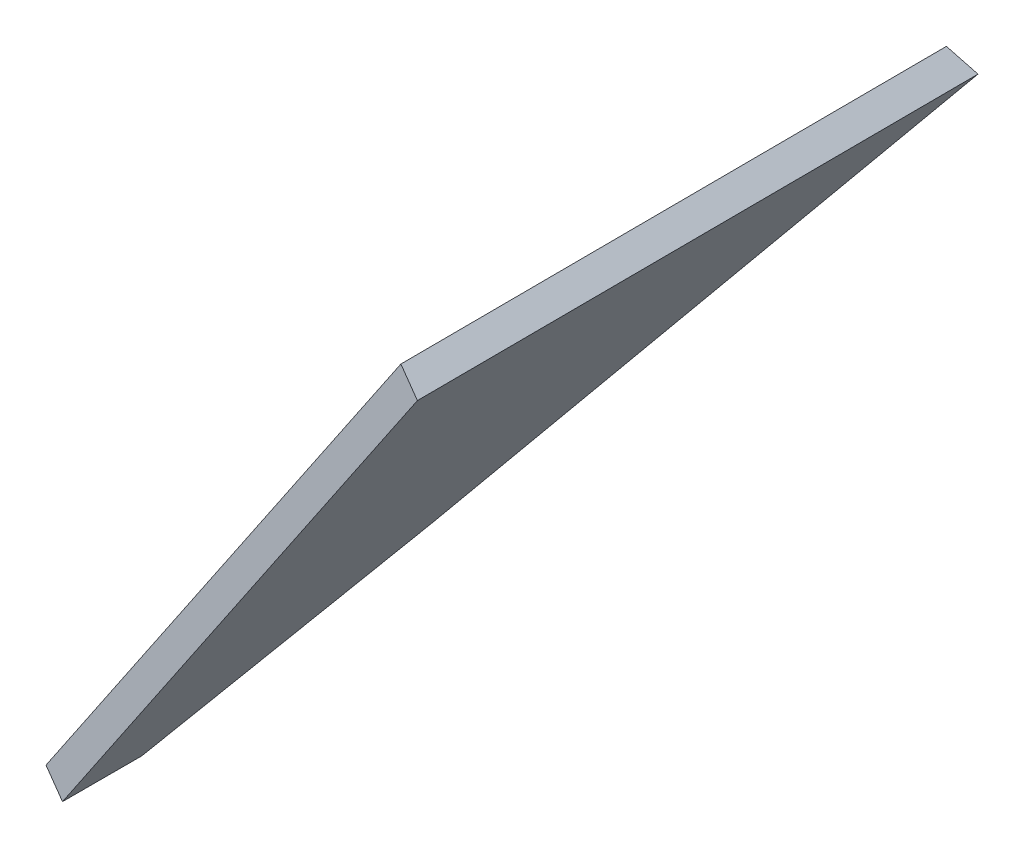
ISO-10303-21;
HEADER;
FILE_DESCRIPTION(('STEP AP214'),'2;1');
FILE_NAME('part.step','',(''),(''),'','','');
FILE_SCHEMA(('AUTOMOTIVE_DESIGN { 1 0 10303 214 1 1 1 1 }'));
ENDSEC;
DATA;
#1=APPLICATION_CONTEXT('core data for automotive mechanical design processes');
#2=APPLICATION_PROTOCOL_DEFINITION('international standard','automotive_design',2000,#1);
#3=PRODUCT_CONTEXT('',#1,'mechanical');
#4=PRODUCT('Part','Part','',(#3));
#5=PRODUCT_RELATED_PRODUCT_CATEGORY('part','',(#4));
#6=PRODUCT_DEFINITION_FORMATION('','',#4);
#7=PRODUCT_DEFINITION_CONTEXT('part definition',#1,'design');
#8=PRODUCT_DEFINITION('design','',#6,#7);
#9=PRODUCT_DEFINITION_SHAPE('','',#8);
#10=(LENGTH_UNIT() NAMED_UNIT(*) SI_UNIT(.MILLI.,.METRE.));
#11=(NAMED_UNIT(*) PLANE_ANGLE_UNIT() SI_UNIT($,.RADIAN.));
#12=(NAMED_UNIT(*) SI_UNIT($,.STERADIAN.) SOLID_ANGLE_UNIT());
#13=UNCERTAINTY_MEASURE_WITH_UNIT(LENGTH_MEASURE(1.E-05),#10,'distance_accuracy_value','');
#14=(GEOMETRIC_REPRESENTATION_CONTEXT(3) GLOBAL_UNCERTAINTY_ASSIGNED_CONTEXT((#13)) GLOBAL_UNIT_ASSIGNED_CONTEXT((#10,
#11,#12)) REPRESENTATION_CONTEXT('',''));
#15=CARTESIAN_POINT('',(0.,0.,0.));
#16=DIRECTION('',(0.,0.,1.));
#17=DIRECTION('',(1.,0.,0.));
#18=AXIS2_PLACEMENT_3D('',#15,#16,#17);
#19=CARTESIAN_POINT('',(-43.7794599718674,348.054082561375,128.512156547839));
#20=DIRECTION('',(0.320862040401385,0.0996172698804472,-0.941872576610566));
#21=DIRECTION('',(-0.946581032931167,0.,-0.322466041770238));
#22=AXIS2_PLACEMENT_3D('',#19,#20,#21);
#23=PLANE('',#22);
#24=CARTESIAN_POINT('',(85.6116867373077,31.4461867373069,139.104983418644));
#25=CARTESIAN_POINT('',(88.4715866466048,35.0292534896405,140.458211742261));
#26=CARTESIAN_POINT('',(91.3316057950625,38.61221396637,141.81146944611));
#27=CARTESIAN_POINT('',(97.0518285389213,45.7779705100532,144.518030299414));
#28=CARTESIAN_POINT('',(99.9120321343222,49.360766577007,145.871333448868));
#29=CARTESIAN_POINT('',(108.492838540022,60.1089803705322,149.931291091531));
#30=CARTESIAN_POINT('',(114.213636982623,67.2742237058078,152.637993785096));
#31=CARTESIAN_POINT('',(125.655539326151,81.6044380135948,158.051474424388));
#32=CARTESIAN_POINT('',(131.376643227078,88.7694089861071,160.758252370115));
#33=CARTESIAN_POINT('',(142.8190486048,103.099174784011,166.171856938323));
#34=CARTESIAN_POINT('',(148.540350081595,110.263969609403,168.878683560805));
#35=CARTESIAN_POINT('',(165.704450080904,131.758179426781,176.999211578725));
#36=CARTESIAN_POINT('',(177.147444305051,146.08741992617,182.412961187425));
#37=CARTESIAN_POINT('',(200.03370041125,174.745662296352,193.240526347643));
#38=CARTESIAN_POINT('',(211.476962293304,189.074664167144,198.654341899161));
#39=CARTESIAN_POINT('',(243.983105583534,229.777670695805,214.032971883399));
#40=CARTESIAN_POINT('',(265.046172875821,256.151509601268,223.997832109311));
#41=CARTESIAN_POINT('',(296.640947449268,295.712113048316,238.945165215174));
#42=CARTESIAN_POINT('',(307.172567895398,308.898955023535,243.927616703339));
#43=CARTESIAN_POINT('',(328.235854203616,335.272598474247,253.892530867788));
#44=CARTESIAN_POINT('',(338.767520065704,348.459399949739,258.874993544074));
#45=CARTESIAN_POINT('',(349.299202399211,361.646186737307,263.857460278108));
#46=B_SPLINE_CURVE_WITH_KNOTS('',3,(#24,#25,#26,#27,#28,#29,#30,#31,#32,#33,#34,#35,#36,#37,#38,
#39,#40,#41,#42,#43,#44,#45),.UNSPECIFIED.,.F.,.F.,(4,2,2,2,2,2,2,2,2,2,4),(0.,14.3400695735833,
28.6801391322005,57.3602781852366,86.0404171547877,114.720556143849,172.080833456703,
229.441110856052,335.019402157811,387.808547633039,440.597693105904),.UNSPECIFIED.);
#47=CARTESIAN_POINT('',(85.6116867373077,31.4461867373068,139.104983418644));
#48=VERTEX_POINT('',#47);
#49=CARTESIAN_POINT('',(349.299202399211,361.646186737307,263.857460278109));
#50=VERTEX_POINT('',#49);
#51=EDGE_CURVE('E114',#48,#50,#46,.T.);
#52=ORIENTED_EDGE('',*,*,#51,.T.);
#53=CARTESIAN_POINT('',(349.299202399211,361.646186737307,263.857460278108));
#54=CARTESIAN_POINT('',(348.574234041957,362.223367623438,263.671535295706));
#55=CARTESIAN_POINT('',(347.849265173027,362.80054778608,263.485610062474));
#56=CARTESIAN_POINT('',(346.036841721498,364.243496383954,263.020796352316));
#57=CARTESIAN_POINT('',(344.949386499302,365.109263914817,262.741907561851));
#58=CARTESIAN_POINT('',(342.77447375234,366.840795720787,262.184128852173));
#59=CARTESIAN_POINT('',(341.687016227574,367.706559995893,261.905238932959));
#60=CARTESIAN_POINT('',(340.599557551521,368.572322643098,261.626348449369));
#61=B_SPLINE_CURVE_WITH_KNOTS('',3,(#53,#54,#55,#56,#57,#58,#59,#60),.UNSPECIFIED.,.F.,.F.,(4,2,
2,4),(0.,2.83541265792917,7.08853164485781,11.3416506318234),.UNSPECIFIED.);
#62=CARTESIAN_POINT('',(340.599557495006,368.572322688092,261.626348434923));
#63=VERTEX_POINT('',#62);
#64=EDGE_CURVE('E253',#50,#63,#61,.T.);
#65=ORIENTED_EDGE('',*,*,#64,.T.);
#66=CARTESIAN_POINT('',(76.9259541736764,38.3776877351481,136.87917844329));
#67=CARTESIAN_POINT('',(79.7878837210808,41.9639059160794,138.233431502696));
#68=CARTESIAN_POINT('',(82.6499643790445,45.5499894343486,139.58772179741));
#69=CARTESIAN_POINT('',(88.3743594929247,52.7219480958637,142.296359994563));
#70=CARTESIAN_POINT('',(91.2366739488408,56.30782323911,143.650707897003));
#71=CARTESIAN_POINT('',(99.8238653725666,67.0652275239982,147.713812718641));
#72=CARTESIAN_POINT('',(105.548990416923,74.2365355465628,150.42263076189));
#73=CARTESIAN_POINT('',(116.999628039582,88.5788060570241,155.840362321721));
#74=CARTESIAN_POINT('',(122.725140617882,95.7497685449225,158.549275838301));
#75=CARTESIAN_POINT('',(134.176416531047,110.091469975375,163.967164651885));
#76=CARTESIAN_POINT('',(139.902179865912,117.262208917928,166.676139948888));
#77=CARTESIAN_POINT('',(157.079718114455,138.774203956893,174.803126950155));
#78=CARTESIAN_POINT('',(168.53174148518,153.115238531505,180.221199865499));
#79=CARTESIAN_POINT('',(191.436128188808,181.79700460929,191.057429454661));
#80=CARTESIAN_POINT('',(202.888491521712,196.137736112463,196.475586128478));
#81=CARTESIAN_POINT('',(235.38361536973,236.827761555284,211.849089239757));
#82=CARTESIAN_POINT('',(256.426610905254,263.176845931666,221.804493575716));
#83=CARTESIAN_POINT('',(287.99132444631,302.700275983461,236.737654322528));
#84=CARTESIAN_POINT('',(298.512932304713,315.874719879897,241.715383598581));
#85=CARTESIAN_POINT('',(319.556205639582,342.223556293254,251.670856344925));
#86=CARTESIAN_POINT('',(330.077871116048,355.397948810175,256.648599815216));
#87=CARTESIAN_POINT('',(340.599557495006,368.572322688092,261.626348434875));
#88=B_SPLINE_CURVE_WITH_KNOTS('',3,(#66,#67,#68,#69,#70,#71,#72,#73,#74,#75,#76,#77,#78,#79,#80,
#81,#82,#83,#84,#85,#86,#87),.UNSPECIFIED.,.F.,.F.,(4,2,2,2,2,2,2,2,2,2,4),(0.,14.3516697941913,
28.7033395643653,57.4066790015691,86.1100183044794,114.813357638734,172.220035238932,
229.626712978188,335.105278834038,387.844561478813,440.583844122906),.UNSPECIFIED.);
#89=CARTESIAN_POINT('',(76.9259541736339,38.377687735146,136.879178466401));
#90=VERTEX_POINT('',#89);
#91=EDGE_CURVE('E171',#90,#63,#88,.T.);
#92=ORIENTED_EDGE('',*,*,#91,.F.);
#93=CARTESIAN_POINT('',(76.9259541735794,38.3776877351288,136.879178443255));
#94=CARTESIAN_POINT('',(78.3736654056012,37.2225633050917,137.250189603792));
#95=CARTESIAN_POINT('',(79.8213320611685,36.067375995199,137.621178928241));
#96=CARTESIAN_POINT('',(81.9927651952136,34.334500738007,138.177630168924));
#97=CARTESIAN_POINT('',(82.7165651007031,33.7568599350014,138.363108458757));
#98=CARTESIAN_POINT('',(84.1641426300847,32.6015469036215,138.734054124179));
#99=CARTESIAN_POINT('',(84.8879202539767,32.0238746752471,138.919521499767));
#100=CARTESIAN_POINT('',(85.6116867373077,31.4461867373069,139.104983418644));
#101=B_SPLINE_CURVE_WITH_KNOTS('',3,(#93,#94,#95,#96,#97,#98,#99,#100),.UNSPECIFIED.,.F.,.F.,(4,
2,2,4),(0.,5.66660973040879,8.49991461408036,11.3332195028445),.UNSPECIFIED.);
#102=EDGE_CURVE('E67',#90,#48,#101,.T.);
#103=ORIENTED_EDGE('',*,*,#102,.T.);
#104=EDGE_LOOP('',(#52,#65,#92,#103));
#105=FACE_BOUND('',#104,.T.);
#106=ADVANCED_FACE('F38',(#105),#23,.F.);
#107=CARTESIAN_POINT('',(125.373540665109,304.904026269313,170.043614927809));
#108=DIRECTION('',(-0.573127406974546,0.259388760360703,-0.777330332852881));
#109=DIRECTION('',(-0.804878930909392,0.,0.593439050432438));
#110=AXIS2_PLACEMENT_3D('',#107,#108,#109);
#111=PLANE('',#110);
#112=CARTESIAN_POINT('',(171.924414734314,139.918657355713,80.6672852883179));
#113=CARTESIAN_POINT('',(173.665506575997,142.211538755921,80.1486900766855));
#114=CARTESIAN_POINT('',(175.405442248545,144.505577520852,79.631333514284));
#115=CARTESIAN_POINT('',(178.883217977308,149.095746072393,78.5988632489228));
#116=CARTESIAN_POINT('',(180.62105803427,151.391875858257,78.0837495451626));
#117=CARTESIAN_POINT('',(184.094848952765,155.985989114493,77.0555336050185));
#118=CARTESIAN_POINT('',(185.830799826776,158.283972572443,76.5424313552888));
#119=CARTESIAN_POINT('',(189.301004711933,162.881624468485,75.5180402207066));
#120=CARTESIAN_POINT('',(191.035258722907,165.181292906748,75.0067513360383));
#121=CARTESIAN_POINT('',(196.235713537649,172.082562590033,73.4753414004066));
#122=CARTESIAN_POINT('',(199.699616289503,176.686440330173,72.4576743560606));
#123=CARTESIAN_POINT('',(206.622358556999,185.899185812328,70.427738525566));
#124=CARTESIAN_POINT('',(210.081198074293,190.508053552712,69.4154697376554));
#125=CARTESIAN_POINT('',(216.99460780353,199.729904940354,67.3954533746809));
#126=CARTESIAN_POINT('',(220.44917805798,204.342888545831,66.3877057543349));
#127=CARTESIAN_POINT('',(227.354748193781,213.57236476622,64.3760138854631));
#128=CARTESIAN_POINT('',(230.805748070725,218.188857385452,63.3720696416293));
#129=CARTESIAN_POINT('',(237.704706271686,227.424823418911,61.367418364647));
#130=CARTESIAN_POINT('',(241.15266459302,232.044296835763,60.3667113343542));
#131=CARTESIAN_POINT('',(248.045968106532,241.285794255005,58.3680750492733));
#132=CARTESIAN_POINT('',(251.491313298386,245.907818257712,57.3701457948301));
#133=CARTESIAN_POINT('',(258.379954149344,255.15434933474,55.3766269917054));
#134=CARTESIAN_POINT('',(261.823249670518,259.778856543397,54.3810375895467));
#135=CARTESIAN_POINT('',(268.707871699028,269.029780850709,52.3919478582082));
#136=CARTESIAN_POINT('',(272.149198207569,273.656197948192,51.3984475277491));
#137=CARTESIAN_POINT('',(279.030128089955,282.910703175008,49.4132749475584));
#138=CARTESIAN_POINT('',(282.469731464315,287.538791303841,48.4216026972805));
#139=CARTESIAN_POINT('',(289.347421759985,296.796437788338,46.4398668836187));
#140=CARTESIAN_POINT('',(292.785508681434,301.425996143867,45.4498033200877));
#141=CARTESIAN_POINT('',(299.660375794562,310.686459682702,43.4710890732212));
#142=CARTESIAN_POINT('',(303.097155972653,315.317364879174,42.4824384042965));
#143=CARTESIAN_POINT('',(309.969523832872,324.580330750287,40.5064018700045));
#144=CARTESIAN_POINT('',(313.405111514844,329.212391425079,39.5190160048018));
#145=CARTESIAN_POINT('',(320.275222994387,338.477543080628,37.5453724834184));
#146=CARTESIAN_POINT('',(323.709746791794,343.110634061545,36.5591148274123));
#147=CARTESIAN_POINT('',(330.577837537534,352.377742077883,34.587614019177));
#148=CARTESIAN_POINT('',(334.011404485729,357.011759113439,33.6023708670949));
#149=CARTESIAN_POINT('',(337.444546295139,361.646186737307,32.6175781807508));
#150=B_SPLINE_CURVE_WITH_KNOTS('',3,(#112,#113,#114,#115,#116,#117,#118,#119,#120,#121,#122,
#123,#124,#125,#126,#127,#128,#129,#130,#131,#132,#133,#134,#135,#136,#137,#138,#139,#140,#141,
#142,#143,#144,#145,#146,#147,#148,#149),.UNSPECIFIED.,.F.,.F.,(4,2,2,2,2,2,2,2,2,2,2,2,2,2,2,2,
2,2,4),(0.,8.77603526900681,17.5520674050813,26.3280412137687,35.1040159138626,52.6559189906871,
70.2078163381776,87.7595374990635,105.311280305654,122.863038591689,140.414799057332,
157.967630803315,175.520451797042,193.073267545195,210.626081688443,228.179073601313,
245.73206779631,263.285064706061,280.838064159246),.UNSPECIFIED.);
#151=CARTESIAN_POINT('',(171.924414734314,139.918657355713,80.6672852883179));
#152=VERTEX_POINT('',#151);
#153=CARTESIAN_POINT('',(177.708290416846,147.545094914688,78.9477004074653));
#154=VERTEX_POINT('',#153);
#155=EDGE_CURVE('E182',#152,#154,#150,.T.);
#156=ORIENTED_EDGE('',*,*,#155,.F.);
#157=CARTESIAN_POINT('',(85.6116867373077,31.4461867373069,108.109479934914));
#158=CARTESIAN_POINT('',(88.010175368803,34.4583313315158,107.346196820089));
#159=CARTESIAN_POINT('',(90.4085032206406,37.4706485645732,106.583089856637));
#160=CARTESIAN_POINT('',(95.2049028319418,43.4955579366349,105.057156481079));
#161=CARTESIAN_POINT('',(97.6029745914068,46.5081500756378,104.294330068971));
#162=CARTESIAN_POINT('',(104.796903853723,55.54623319602,102.006164057349));
#163=CARTESIAN_POINT('',(109.592475455651,61.5720310254054,100.481137645895));
#164=CARTESIAN_POINT('',(119.183142648748,73.6241373487767,97.4316061913833));
#165=CARTESIAN_POINT('',(123.978238239918,79.6504458427614,95.9071011483249));
#166=CARTESIAN_POINT('',(133.568109028747,91.7034064081565,92.8584419380367));
#167=CARTESIAN_POINT('',(138.362884226409,97.730058479564,91.334287770804));
#168=CARTESIAN_POINT('',(147.952211224536,109.783602331242,88.2862241364778));
#169=CARTESIAN_POINT('',(152.746763024999,115.810494111515,86.7623146693869));
#170=CARTESIAN_POINT('',(162.33569983702,127.864456677606,83.714678441724));
#171=CARTESIAN_POINT('',(167.130084848576,133.891527463425,82.1909516811542));
#172=CARTESIAN_POINT('',(171.924414734314,139.918657355713,80.6672852883179));
#173=B_SPLINE_CURVE_WITH_KNOTS('',3,(#157,#158,#159,#160,#161,#162,#163,#164,#165,#166,#167,
#168,#169,#170,#171,#172),.UNSPECIFIED.,.F.,.F.,(4,2,2,2,2,2,2,4),(0.,11.7760466247532,
23.5520931886116,47.1041857509119,70.6562782599662,94.2083705670895,117.760463123086,
141.312555977967),.UNSPECIFIED.);
#174=CARTESIAN_POINT('',(85.6116867373077,31.4461867373069,108.109479934914));
#175=VERTEX_POINT('',#174);
#176=EDGE_CURVE('E179',#175,#152,#173,.T.);
#177=ORIENTED_EDGE('',*,*,#176,.F.);
#178=CARTESIAN_POINT('',(76.9207661918264,38.3711817786551,116.828129329258));
#179=CARTESIAN_POINT('',(78.060106148323,37.4627396115297,115.684951705843));
#180=CARTESIAN_POINT('',(79.1995483968771,36.5544546388475,114.54175111676));
#181=CARTESIAN_POINT('',(81.2177369212999,34.9461165383041,112.517046926776));
#182=CARTESIAN_POINT('',(82.0964417150751,34.2459996420327,111.63555263172));
#183=CARTESIAN_POINT('',(83.8539729749667,32.8459528893293,109.872536745977));
#184=CARTESIAN_POINT('',(84.7327994410861,32.1460230329018,108.99101515529));
#185=CARTESIAN_POINT('',(85.6116867373077,31.4461867373069,108.109479934914));
#186=B_SPLINE_CURVE_WITH_KNOTS('',3,(#178,#179,#180,#181,#182,#183,#184,#185),.UNSPECIFIED.,.F.,
.F.,(4,2,2,4),(0.,5.5562541273027,9.84039483802176,14.1245356548903),.UNSPECIFIED.);
#187=CARTESIAN_POINT('',(76.9207661918495,38.3711817786637,116.828129343839));
#188=VERTEX_POINT('',#187);
#189=EDGE_CURVE('E184',#188,#175,#186,.T.);
#190=ORIENTED_EDGE('',*,*,#189,.F.);
#191=CARTESIAN_POINT('',(76.9207661918651,38.3711817786628,116.828129329232));
#192=CARTESIAN_POINT('',(78.870188885859,40.8177287860045,116.207208264006));
#193=CARTESIAN_POINT('',(80.8194476616511,43.2644519711509,115.586466845129));
#194=CARTESIAN_POINT('',(84.7176953712788,48.1581882589645,114.345279705558));
#195=CARTESIAN_POINT('',(86.6666843051166,50.6052013616293,113.724833984862));
#196=CARTESIAN_POINT('',(92.513333190501,57.9465817068476,111.863845024378));
#197=CARTESIAN_POINT('',(96.4106754183145,62.8412902281106,110.623649924924));
#198=CARTESIAN_POINT('',(104.204791978514,72.6313168734862,108.143881856067));
#199=CARTESIAN_POINT('',(108.101566310903,77.5266349975948,106.904308886662));
#200=CARTESIAN_POINT('',(115.894713056689,87.3177022717248,104.425603113444));
#201=CARTESIAN_POINT('',(119.7910854701,92.2134514217305,103.186470309616));
#202=CARTESIAN_POINT('',(127.583536721696,102.00526481901,100.708526301012));
#203=CARTESIAN_POINT('',(131.479615559878,106.901329066288,99.469715096239));
#204=CARTESIAN_POINT('',(139.271551821627,116.693695132511,96.9923352119064));
#205=CARTESIAN_POINT('',(143.167409245193,121.589996951459,95.7537665323479));
#206=CARTESIAN_POINT('',(152.470042521118,133.281991898247,92.7964369198038));
#207=CARTESIAN_POINT('',(157.876739514006,140.07776961547,91.0777623568667));
#208=CARTESIAN_POINT('',(168.689897527855,153.669578069907,87.6406716443231));
#209=CARTESIAN_POINT('',(174.096358548818,160.465608807121,85.9222554947154));
#210=CARTESIAN_POINT('',(184.909104345647,174.057859265263,82.4856162037241));
#211=CARTESIAN_POINT('',(190.315389121513,180.854078986192,80.7673930623403));
#212=CARTESIAN_POINT('',(201.127824058467,194.446663417265,77.3310944130648));
#213=CARTESIAN_POINT('',(206.533974219548,201.243028127417,75.6130189051807));
#214=CARTESIAN_POINT('',(217.346169303768,214.835870409057,72.1769831424876));
#215=CARTESIAN_POINT('',(222.752214226906,221.632347980545,70.4590228876788));
#216=CARTESIAN_POINT('',(233.564219124732,235.225394235959,67.023195414219));
#217=CARTESIAN_POINT('',(238.97017909942,242.021962919885,65.3053281955683));
#218=CARTESIAN_POINT('',(244.376106735962,248.818566274687,63.5874963892915));
#219=B_SPLINE_CURVE_WITH_KNOTS('',3,(#191,#192,#193,#194,#195,#196,#197,#198,#199,#200,#201,
#202,#203,#204,#205,#206,#207,#208,#209,#210,#211,#212,#213,#214,#215,#216,#217,#218),
.UNSPECIFIED.,.F.,.F.,(4,2,2,2,2,2,2,2,2,2,2,2,2,4),(0.,9.56778217613013,19.1355642745629,
38.2711275270922,57.4066906488929,76.5422530720067,95.6778156985162,114.813378405217,
141.371226281731,167.929074032651,194.486921738915,221.044770794422,247.602619891668,
274.160469052355),.UNSPECIFIED.);
#220=CARTESIAN_POINT('',(213.853371212455,210.444810367556,73.2869703073506));
#221=VERTEX_POINT('',#220);
#222=EDGE_CURVE('E115',#188,#221,#219,.T.);
#223=ORIENTED_EDGE('',*,*,#222,.T.);
#224=DIRECTION('',(-0.496730625068711,-0.864411263879176,0.0777936565386454));
#225=VECTOR('',#224,1.);
#226=CARTESIAN_POINT('',(228.841679114316,236.527482792002,70.9396310893358));
#227=LINE('',#226,#225);
#228=EDGE_CURVE('E113',#221,#154,#227,.T.);
#229=ORIENTED_EDGE('',*,*,#228,.T.);
#230=EDGE_LOOP('',(#156,#177,#190,#223,#229));
#231=FACE_BOUND('',#230,.T.);
#232=ADVANCED_FACE('F147',(#231),#111,.T.);
#233=CARTESIAN_POINT('',(48.9977785016991,346.433963694555,143.830238777529));
#234=DIRECTION('',(-0.320862040401468,0.0996172698803115,-0.941872576610552));
#235=DIRECTION('',(-0.94658103293114,0.,0.322466041770318));
#236=AXIS2_PLACEMENT_3D('',#233,#234,#235);
#237=PLANE('',#236);
#238=CARTESIAN_POINT('',(85.6116867373077,31.4461867373069,98.0424785638344));
#239=CARTESIAN_POINT('',(87.2131690050096,33.4802214644686,97.7120412101533));
#240=CARTESIAN_POINT('',(88.815466812221,35.5135565698957,97.381252035975));
#241=CARTESIAN_POINT('',(92.0214558864337,39.5790294634869,96.7190723516814));
#242=CARTESIAN_POINT('',(93.6251471532035,41.6111672518498,96.3876818416661));
#243=CARTESIAN_POINT('',(96.8336840435654,45.6744455601531,95.7244020976523));
#244=CARTESIAN_POINT('',(98.4385296657043,47.7055860813434,95.3925128642812));
#245=CARTESIAN_POINT('',(101.649204107663,51.7670205741813,94.7283099221076));
#246=CARTESIAN_POINT('',(103.255032927529,53.7973145457883,94.3959962132848));
#247=CARTESIAN_POINT('',(108.073770046511,59.8871166153831,93.3985148222761));
#248=CARTESIAN_POINT('',(111.287929835593,63.9455459196525,92.7328067038128));
#249=CARTESIAN_POINT('',(117.718728182269,72.0602529433271,91.4003184771527));
#250=CARTESIAN_POINT('',(120.935366735887,76.116530666165,90.7335383706731));
#251=CARTESIAN_POINT('',(127.37055309952,84.2274373784788,89.3991533643836));
#252=CARTESIAN_POINT('',(130.589100910064,88.2820663674969,88.7315484643449));
#253=CARTESIAN_POINT('',(137.027693388977,96.3900296235508,87.3956918023243));
#254=CARTESIAN_POINT('',(140.247738057485,100.443363890467,86.7274400402827));
#255=CARTESIAN_POINT('',(148.299316507231,110.575383767205,85.0561717918653));
#256=CARTESIAN_POINT('',(153.131594392911,116.653424990918,84.0528336623481));
#257=CARTESIAN_POINT('',(162.798110625394,128.807807005573,82.0453096983841));
#258=CARTESIAN_POINT('',(167.632348971989,134.884147796695,81.0411238640274));
#259=CARTESIAN_POINT('',(177.302314240629,147.035543407758,79.0321090804067));
#260=CARTESIAN_POINT('',(182.13804116341,153.110598227059,78.0272801308244));
#261=CARTESIAN_POINT('',(191.810646679173,165.259708814939,76.0171242344072));
#262=CARTESIAN_POINT('',(196.647525272187,171.333764583488,75.0117972875575));
#263=CARTESIAN_POINT('',(207.601148383944,185.086922276209,72.7348971068959));
#264=CARTESIAN_POINT('',(213.718164782186,192.765788193395,71.4632062922292));
#265=CARTESIAN_POINT('',(225.953303280977,208.122559883884,68.9193464402341));
#266=CARTESIAN_POINT('',(232.071425381531,215.800465657185,67.6471774029037));
#267=CARTESIAN_POINT('',(250.427066721103,238.833069841581,63.8301182005357));
#268=CARTESIAN_POINT('',(262.665863632501,254.186658424454,61.284675397448));
#269=CARTESIAN_POINT('',(287.145624172898,284.891956756862,56.1928529536366));
#270=CARTESIAN_POINT('',(299.386587802242,300.2436665061,53.6464733127638));
#271=CARTESIAN_POINT('',(317.749149059721,323.27026375885,49.8264214198984));
#272=CARTESIAN_POINT('',(323.870189378005,330.945635696248,48.5529902594956));
#273=CARTESIAN_POINT('',(336.112585769803,346.296105073702,46.0059913400183));
#274=CARTESIAN_POINT('',(342.233941843315,353.971202513758,44.7324235809439));
#275=CARTESIAN_POINT('',(348.355427906917,361.64618694067,43.4587995860821));
#276=B_SPLINE_CURVE_WITH_KNOTS('',3,(#238,#239,#240,#241,#242,#243,#244,#245,#246,#247,#248,
#249,#250,#251,#252,#253,#254,#255,#256,#257,#258,#259,#260,#261,#262,#263,#264,#265,#266,#267,
#268,#269,#270,#271,#272,#273,#274,#275),.UNSPECIFIED.,.F.,.F.,(4,2,2,2,2,2,2,2,2,2,2,2,2,2,2,2,
2,2,4),(0.,7.8295002371344,15.6589991735866,23.4884882711674,31.3179777445532,46.9769526385144,
62.6359024726599,78.2948566521888,93.9538122749013,117.442141397294,140.930468022424,
164.418806282897,187.907145234399,217.605640319198,247.304135524156,306.701113143207,
366.098100217514,395.796599546118,425.495098850916),.UNSPECIFIED.);
#277=CARTESIAN_POINT('',(348.355428279554,361.646186737307,43.4588001512512));
#278=VERTEX_POINT('',#277);
#279=EDGE_CURVE('E168',#154,#278,#276,.T.);
#280=ORIENTED_EDGE('',*,*,#279,.F.);
#281=ORIENTED_EDGE('',*,*,#228,.F.);
#282=CARTESIAN_POINT('',(76.9168605079251,38.3662772779602,101.736396720365));
#283=CARTESIAN_POINT('',(82.8257347122653,45.7905850958167,100.508689080468));
#284=CARTESIAN_POINT('',(88.7344669034671,53.215016088025,99.2810428468799));
#285=CARTESIAN_POINT('',(100.551741040938,68.0640430733313,96.8258326406341));
#286=CARTESIAN_POINT('',(106.460282987208,75.4886390664292,95.5982686679768));
#287=CARTESIAN_POINT('',(124.185764132161,97.7625525272532,91.9156393135562));
#288=CARTESIAN_POINT('',(136.00255864062,112.611995481073,89.4606364945897));
#289=CARTESIAN_POINT('',(159.635983670446,142.311023570843,84.5507017590594));
#290=CARTESIAN_POINT('',(171.452614191813,157.160608706793,82.0957698424956));
#291=CARTESIAN_POINT('',(195.085787775342,186.859854830213,77.1859438260122));
#292=CARTESIAN_POINT('',(206.902330837505,201.709515817683,74.7310497260926));
#293=CARTESIAN_POINT('',(238.878909847789,241.894111429096,68.0879104781471));
#294=CARTESIAN_POINT('',(259.038899469027,267.229086228659,63.8996853611998));
#295=CARTESIAN_POINT('',(299.35880387883,317.899100708815,55.5232674822507));
#296=CARTESIAN_POINT('',(319.518718667394,343.234140389407,51.3350747202489));
#297=CARTESIAN_POINT('',(339.678629202638,368.569183758141,47.1468837972767));
#298=B_SPLINE_CURVE_WITH_KNOTS('',3,(#282,#283,#284,#285,#286,#287,#288,#289,#290,#291,#292,
#293,#294,#295,#296,#297),.UNSPECIFIED.,.F.,.F.,(4,2,2,2,2,2,2,4),(0.,28.7033388719615,
57.4066777355721,114.813355445152,172.220033076604,229.626710717725,327.567745188632,
425.508779625291),.UNSPECIFIED.);
#299=CARTESIAN_POINT('',(339.132666033389,367.883069094712,47.2603067692652));
#300=VERTEX_POINT('',#299);
#301=EDGE_CURVE('E102',#221,#300,#298,.T.);
#302=ORIENTED_EDGE('',*,*,#301,.T.);
#303=CARTESIAN_POINT('',(339.678629202212,368.569183757606,47.1468837974952));
#304=CARTESIAN_POINT('',(339.655880741589,368.540595650613,47.1516100472306));
#305=CARTESIAN_POINT('',(339.633132277955,368.512007540086,47.1563362610903));
#306=CARTESIAN_POINT('',(339.587635350045,368.454831318725,47.1657886156588));
#307=CARTESIAN_POINT('',(339.564886885769,368.426243207891,47.1705147563676));
#308=CARTESIAN_POINT('',(339.51938995667,368.369066986036,47.179966964333));
#309=CARTESIAN_POINT('',(339.496641491847,368.340478875016,47.1846930315896));
#310=CARTESIAN_POINT('',(339.451144561606,368.283302652732,47.1941450920742));
#311=CARTESIAN_POINT('',(339.428396096189,368.254714541468,47.1988710853023));
#312=CARTESIAN_POINT('',(339.382899165117,368.19753831914,47.2083229992116));
#313=CARTESIAN_POINT('',(339.360150699463,368.168950208076,47.213048919893));
#314=CARTESIAN_POINT('',(339.314653767833,368.111773986044,47.2225006876548));
#315=CARTESIAN_POINT('',(339.291905301857,368.083185875076,47.2272265347354));
#316=CARTESIAN_POINT('',(339.24640836942,368.02600965303,47.2366781559187));
#317=CARTESIAN_POINT('',(339.223659902959,367.997421541951,47.2414039300216));
#318=CARTESIAN_POINT('',(339.178162969793,367.94024531999,47.2508554047232));
#319=CARTESIAN_POINT('',(339.155414503089,367.911657209106,47.2555811053221));
#320=CARTESIAN_POINT('',(339.132666033331,367.883069094638,47.2603067695397));
#321=B_SPLINE_CURVE_WITH_KNOTS('',3,(#303,#304,#305,#306,#307,#308,#309,#310,#311,#312,#313,
#314,#315,#316,#317,#318,#319,#320),.UNSPECIFIED.,.F.,.F.,(4,2,2,2,2,2,2,2,4),(0.,
0.11051691195473,0.221033797658619,0.331550656541025,0.442067488599383,0.552584292710562,
0.663101068869452,0.773617818097744,0.884134539036192),.UNSPECIFIED.);
#322=CARTESIAN_POINT('',(339.678629202637,368.569183758141,47.1468837972768));
#323=VERTEX_POINT('',#322);
#324=EDGE_CURVE('E97',#300,#323,#321,.F.);
#325=ORIENTED_EDGE('',*,*,#324,.T.);
#326=CARTESIAN_POINT('',(348.355428111511,361.646186868948,43.4587995087987));
#327=CARTESIAN_POINT('',(347.993893049808,361.934642845405,43.6124696950811));
#328=CARTESIAN_POINT('',(347.632358209834,362.223099100272,43.766139880414));
#329=CARTESIAN_POINT('',(346.909288973345,362.800012166823,44.0734802491808));
#330=CARTESIAN_POINT('',(346.54775457683,363.088468978507,44.2271504326148));
#331=CARTESIAN_POINT('',(345.824686227258,363.665383158692,44.5344907975838));
#332=CARTESIAN_POINT('',(345.463152274202,363.953840527192,44.6881609791187));
#333=CARTESIAN_POINT('',(344.740084811547,364.530755821006,44.9955013402898));
#334=CARTESIAN_POINT('',(344.378551301948,364.81921374632,45.1491715199259));
#335=CARTESIAN_POINT('',(343.65548472621,365.396130153761,45.4565118772991));
#336=CARTESIAN_POINT('',(343.29395166007,365.684588635888,45.6101820550362));
#337=CARTESIAN_POINT('',(342.570885971247,366.261506156952,45.9175224086115));
#338=CARTESIAN_POINT('',(342.209353348565,366.54996519589,46.0711925844497));
#339=CARTESIAN_POINT('',(341.486288546658,367.126883830576,46.3785329342272));
#340=CARTESIAN_POINT('',(341.124756367433,367.415343426324,46.5322031081664));
#341=CARTESIAN_POINT('',(340.401692452442,367.992263174627,46.839543454146));
#342=CARTESIAN_POINT('',(340.040160716675,368.280723327183,46.9932136261863));
#343=CARTESIAN_POINT('',(339.678629202637,368.569183758141,47.1468837972768));
#344=B_SPLINE_CURVE_WITH_KNOTS('',3,(#326,#327,#328,#329,#330,#331,#332,#333,#334,#335,#336,
#337,#338,#339,#340,#341,#342,#343),.UNSPECIFIED.,.F.,.F.,(4,2,2,2,2,2,2,2,4),(0.,
1.46210833939234,2.92421667878555,4.38632501818021,5.84843335757727,7.31054169697744,
8.7726500363815,10.2347583757903,11.6968667152045),.UNSPECIFIED.);
#345=EDGE_CURVE('E58',#323,#278,#344,.F.);
#346=ORIENTED_EDGE('',*,*,#345,.T.);
#347=EDGE_LOOP('',(#280,#281,#302,#325,#346));
#348=FACE_BOUND('',#347,.T.);
#349=ADVANCED_FACE('F111',(#348),#237,.T.);
#350=CARTESIAN_POINT('',(348.335582062564,361.646186737307,38.8241322344509));
#351=CARTESIAN_POINT('',(348.342197468227,361.646186737307,40.369021540051));
#352=CARTESIAN_POINT('',(348.34881287389,361.646186737307,41.9139108456511));
#353=CARTESIAN_POINT('',(348.355428279554,361.646186737307,43.4588001512512));
#354=CARTESIAN_POINT('',(349.010418939274,361.646186737307,196.41813733938));
#355=CARTESIAN_POINT('',(349.665409598995,361.646186737307,349.37747452751));
#356=CARTESIAN_POINT('',(350.320400258716,361.646186737307,502.336811715639));
#357=CARTESIAN_POINT('',(350.326950165314,361.646186737307,503.866405087521));
#358=CARTESIAN_POINT('',(350.333500071911,361.646186737307,505.395998459402));
#359=CARTESIAN_POINT('',(350.340049978508,361.646186737307,506.925591831283));
#360=CARTESIAN_POINT('',(339.643052932137,368.569062444801,38.861354711316));
#361=CARTESIAN_POINT('',(339.649686352475,368.569085064513,40.406243939775));
#362=CARTESIAN_POINT('',(339.656319772814,368.569107684224,41.9511331682341));
#363=CARTESIAN_POINT('',(339.662953193152,368.569130303936,43.4960223966931));
#364=CARTESIAN_POINT('',(340.319727484085,368.571369879345,196.455351947095));
#365=CARTESIAN_POINT('',(340.976501542562,368.573607386804,349.414681498492));
#366=CARTESIAN_POINT('',(341.633275365821,368.575842829401,502.374011050896));
#367=CARTESIAN_POINT('',(341.639843104054,368.575865183827,503.90360434642));
#368=CARTESIAN_POINT('',(341.646410842286,368.575887538253,505.433197641944));
#369=CARTESIAN_POINT('',(341.652978580519,368.575909892679,506.962790937468));
#370=B_SPLINE_SURFACE_WITH_KNOTS('',1,3,((#350,#351,#352,#353,#354,#355,#356,#357,#358,#359),
(#360,#361,#362,#363,#364,#365,#366,#367,#368,#369)),.UNSPECIFIED.,.F.,.F.,.F.,(2,2),(4,3,3,4),
(0.,1.),(-0.234075819743937,-0.229441109335362,0.229441109335361,0.234029931522068),.UNSPECIFIED.);
#371=CARTESIAN_POINT('',(348.355428279554,361.646186737307,43.4588001512512));
#372=CARTESIAN_POINT('',(348.682923609414,361.646186737307,119.938468745316));
#373=CARTESIAN_POINT('',(349.010418939275,361.646186737307,196.418137339381));
#374=CARTESIAN_POINT('',(349.665409598995,361.646186737307,349.377474527511));
#375=CARTESIAN_POINT('',(349.992904928856,361.646186737307,425.857143121575));
#376=CARTESIAN_POINT('',(350.320400258716,361.646186737307,502.336811715639));
#377=B_SPLINE_CURVE_WITH_KNOTS('',3,(#371,#372,#373,#374,#375,#376),.UNSPECIFIED.,.F.,.F.,(4,2,
4),(0.,0.5,1.),.UNSPECIFIED.);
#378=EDGE_CURVE('E107',#278,#50,#377,.T.);
#379=CARTESIAN_POINT('',(339.643052932137,368.569062444801,38.861354711316));
#380=CARTESIAN_POINT('',(339.649686352475,368.569085064513,40.406243939775));
#381=CARTESIAN_POINT('',(339.656319772814,368.569107684224,41.9511331682341));
#382=CARTESIAN_POINT('',(339.662953193152,368.569130303936,43.4960223966931));
#383=CARTESIAN_POINT('',(340.319727484085,368.571369879345,196.455351947095));
#384=CARTESIAN_POINT('',(340.976501542562,368.573607386804,349.414681498492));
#385=CARTESIAN_POINT('',(341.633275365821,368.575842829401,502.374011050896));
#386=CARTESIAN_POINT('',(341.639843104054,368.575865183827,503.90360434642));
#387=CARTESIAN_POINT('',(341.646410842287,368.575887538253,505.433197641944));
#388=CARTESIAN_POINT('',(341.652978580519,368.575909892679,506.962790937468));
#389=B_SPLINE_CURVE_WITH_KNOTS('',3,(#379,#380,#381,#382,#383,#384,#385,#386,#387,#388),
.UNSPECIFIED.,.F.,.F.,(4,3,3,4),(-0.234075819743937,-0.229441109335362,0.229441109335361,
0.234029931522068),.UNSPECIFIED.);
#390=EDGE_CURVE('E11',#323,#63,#389,.T.);
#391=ORIENTED_EDGE('',*,*,#64,.F.);
#392=ORIENTED_EDGE('',*,*,#378,.F.);
#393=ORIENTED_EDGE('',*,*,#345,.F.);
#394=ORIENTED_EDGE('',*,*,#390,.T.);
#395=EDGE_LOOP('',(#391,#392,#393,#394));
#396=FACE_BOUND('',#395,.T.);
#397=ADVANCED_FACE('F146',(#396),#370,.T.);
#398=CARTESIAN_POINT('',(85.6116867373077,31.4461867373069,196.277230001507));
#399=CARTESIAN_POINT('',(85.6116867373077,31.4461867373069,163.808233537469));
#400=CARTESIAN_POINT('',(85.6116867373077,31.4461867373069,131.339237073432));
#401=CARTESIAN_POINT('',(85.6116867373077,31.4461867373069,98.8702406093947));
#402=CARTESIAN_POINT('',(76.9413148748088,38.3968923141521,196.277230001507));
#403=CARTESIAN_POINT('',(76.9329214572068,38.3864222904974,163.808233537469));
#404=CARTESIAN_POINT('',(76.9245226279307,38.3759066566038,131.339237073432));
#405=CARTESIAN_POINT('',(76.9161186737156,38.365345089407,98.8702406093947));
#406=B_SPLINE_SURFACE_WITH_KNOTS('',1,3,((#398,#399,#400,#401),(#402,#403,#404,#405)),
.UNSPECIFIED.,.F.,.F.,.F.,(2,2),(4,4),(0.,1.),(-0.048703494696056,0.0487034946960561),.UNSPECIFIED.);
#407=CARTESIAN_POINT('',(76.9413148748088,38.3968923141521,196.277230001507));
#408=CARTESIAN_POINT('',(76.9329214572068,38.3864222904974,163.808233537469));
#409=CARTESIAN_POINT('',(76.9245226279307,38.3759066566038,131.339237073432));
#410=CARTESIAN_POINT('',(76.9161186737156,38.365345089407,98.8702406093947));
#411=B_SPLINE_CURVE_WITH_KNOTS('',3,(#407,#408,#409,#410),.UNSPECIFIED.,.F.,.F.,(4,4),
(-0.048703494696056,0.0487034946960561),.UNSPECIFIED.);
#412=EDGE_CURVE('E52',#90,#188,#411,.T.);
#413=CARTESIAN_POINT('',(85.6116867373077,31.4461867373069,196.277230001507));
#414=CARTESIAN_POINT('',(85.6116867373077,31.4461867373069,180.042731769488));
#415=CARTESIAN_POINT('',(85.6116867373077,31.4461867373069,163.808233537469));
#416=CARTESIAN_POINT('',(85.6116867373077,31.4461867373069,131.339237073432));
#417=CARTESIAN_POINT('',(85.6116867373077,31.4461867373069,115.104738841413));
#418=CARTESIAN_POINT('',(85.6116867373077,31.4461867373069,98.8702406093947));
#419=B_SPLINE_CURVE_WITH_KNOTS('',3,(#413,#414,#415,#416,#417,#418),.UNSPECIFIED.,.F.,.F.,(4,2,
4),(0.,0.5,1.),.UNSPECIFIED.);
#420=EDGE_CURVE('E170',#48,#175,#419,.T.);
#421=ORIENTED_EDGE('',*,*,#412,.T.);
#422=ORIENTED_EDGE('',*,*,#189,.T.);
#423=ORIENTED_EDGE('',*,*,#420,.F.);
#424=ORIENTED_EDGE('',*,*,#102,.F.);
#425=EDGE_LOOP('',(#421,#422,#423,#424));
#426=FACE_BOUND('',#425,.T.);
#427=ADVANCED_FACE('F150',(#426),#406,.T.);
#428=CARTESIAN_POINT('',(85.6116867373077,31.4461867373069,196.277230001507));
#429=CARTESIAN_POINT('',(350.320400258716,361.646186737307,502.336811715639));
#430=CARTESIAN_POINT('',(85.6116867373077,31.4461867373069,180.042731769488));
#431=CARTESIAN_POINT('',(349.992904928856,361.646186737307,425.857143121575));
#432=CARTESIAN_POINT('',(85.6116867373077,31.4461867373069,163.808233537469));
#433=CARTESIAN_POINT('',(349.665409598995,361.646186737307,349.377474527511));
#434=CARTESIAN_POINT('',(85.6116867373077,31.4461867373069,131.339237073432));
#435=CARTESIAN_POINT('',(349.010418939275,361.646186737307,196.418137339381));
#436=CARTESIAN_POINT('',(85.6116867373077,31.4461867373069,115.104738841413));
#437=CARTESIAN_POINT('',(348.682923609414,361.646186737307,119.938468745316));
#438=CARTESIAN_POINT('',(85.6116867373077,31.4461867373069,98.8702406093947));
#439=CARTESIAN_POINT('',(348.355428279554,361.646186737307,43.4588001512512));
#440=B_SPLINE_SURFACE_WITH_KNOTS('',3,1,((#428,#429),(#430,#431),(#432,#433),(#434,#435),(#436,
#437),(#438,#439)),.UNSPECIFIED.,.F.,.F.,.F.,(4,2,4),(2,2),(0.,0.5,1.),(0.,1.),.UNSPECIFIED.);
#441=OFFSET_SURFACE('',#440,-11.1125,.F.);
#442=ORIENTED_EDGE('',*,*,#301,.F.);
#443=ORIENTED_EDGE('',*,*,#222,.F.);
#444=ORIENTED_EDGE('',*,*,#412,.F.);
#445=ORIENTED_EDGE('',*,*,#91,.T.);
#446=ORIENTED_EDGE('',*,*,#390,.F.);
#447=ORIENTED_EDGE('',*,*,#324,.F.);
#448=EDGE_LOOP('',(#442,#443,#444,#445,#446,#447));
#449=FACE_BOUND('',#448,.T.);
#450=ADVANCED_FACE('F100',(#449),#441,.F.);
#451=CARTESIAN_POINT('',(85.6116867373077,31.4461867373069,196.277230001507));
#452=CARTESIAN_POINT('',(350.320400258716,361.646186737307,502.336811715639));
#453=CARTESIAN_POINT('',(85.6116867373077,31.4461867373069,180.042731769488));
#454=CARTESIAN_POINT('',(349.992904928856,361.646186737307,425.857143121575));
#455=CARTESIAN_POINT('',(85.6116867373077,31.4461867373069,163.808233537469));
#456=CARTESIAN_POINT('',(349.665409598995,361.646186737307,349.377474527511));
#457=CARTESIAN_POINT('',(85.6116867373077,31.4461867373069,131.339237073432));
#458=CARTESIAN_POINT('',(349.010418939275,361.646186737307,196.418137339381));
#459=CARTESIAN_POINT('',(85.6116867373077,31.4461867373069,115.104738841413));
#460=CARTESIAN_POINT('',(348.682923609414,361.646186737307,119.938468745316));
#461=CARTESIAN_POINT('',(85.6116867373077,31.4461867373069,98.8702406093947));
#462=CARTESIAN_POINT('',(348.355428279554,361.646186737307,43.4588001512512));
#463=B_SPLINE_SURFACE_WITH_KNOTS('',3,1,((#451,#452),(#453,#454),(#455,#456),(#457,#458),(#459,
#460),(#461,#462)),.UNSPECIFIED.,.F.,.F.,.F.,(4,2,4),(2,2),(0.,0.5,1.),(0.,1.),.UNSPECIFIED.);
#464=DIRECTION('',(0.617346662647269,0.775842906131988,-0.130195557231998));
#465=VECTOR('',#464,1.);
#466=CARTESIAN_POINT('',(216.983557508431,196.546186737307,71.1645203803229));
#467=LINE('',#466,#465);
#468=EDGE_CURVE('E175',#152,#278,#467,.T.);
#469=ORIENTED_EDGE('',*,*,#420,.T.);
#470=ORIENTED_EDGE('',*,*,#176,.T.);
#471=ORIENTED_EDGE('',*,*,#468,.T.);
#472=ORIENTED_EDGE('',*,*,#378,.T.);
#473=ORIENTED_EDGE('',*,*,#51,.F.);
#474=EDGE_LOOP('',(#469,#470,#471,#472,#473));
#475=FACE_BOUND('',#474,.T.);
#476=ADVANCED_FACE('F177',(#475),#463,.T.);
#477=CARTESIAN_POINT('',(85.6116867373077,31.4461867373069,98.8702406093947));
#478=CARTESIAN_POINT('',(348.355428279554,361.646186737307,43.4588001512512));
#479=CARTESIAN_POINT('',(85.6116867373077,31.4461867373069,94.1097338411627));
#480=CARTESIAN_POINT('',(332.446693014069,361.646186737307,27.6516334593728));
#481=CARTESIAN_POINT('',(85.6116867373077,31.4461867373069,89.3492270729308));
#482=CARTESIAN_POINT('',(316.537957748583,361.646186737307,11.8444667674944));
#483=CARTESIAN_POINT('',(85.6116867373077,31.4461867373069,79.828213536467));
#484=CARTESIAN_POINT('',(284.720487217612,361.646186737307,-19.7698666162626));
#485=CARTESIAN_POINT('',(85.6116867373077,31.4461867373069,75.0677067682351));
#486=CARTESIAN_POINT('',(268.811751952127,361.646186737307,-35.5770333081412));
#487=CARTESIAN_POINT('',(85.6116867373077,31.4461867373069,70.3072000000032));
#488=CARTESIAN_POINT('',(252.903016686641,361.646186737307,-51.3842000000199));
#489=B_SPLINE_SURFACE_WITH_KNOTS('',3,1,((#477,#478),(#479,#480),(#481,#482),(#483,#484),(#485,
#486),(#487,#488)),.UNSPECIFIED.,.F.,.F.,.F.,(4,2,4),(2,2),(0.,0.5,1.),(0.,1.),.UNSPECIFIED.);
#490=ORIENTED_EDGE('',*,*,#155,.T.);
#491=ORIENTED_EDGE('',*,*,#279,.T.);
#492=ORIENTED_EDGE('',*,*,#468,.F.);
#493=EDGE_LOOP('',(#490,#491,#492));
#494=FACE_BOUND('',#493,.T.);
#495=ADVANCED_FACE('F40',(#494),#489,.T.);
#496=CLOSED_SHELL('',(#106,#232,#349,#397,#427,#450,#476,#495));
#497=MANIFOLD_SOLID_BREP('B2',#496);
#498=ADVANCED_BREP_SHAPE_REPRESENTATION('',(#18,#497),#14);
#499=SHAPE_DEFINITION_REPRESENTATION(#9,#498);
ENDSEC;
END-ISO-10303-21;
